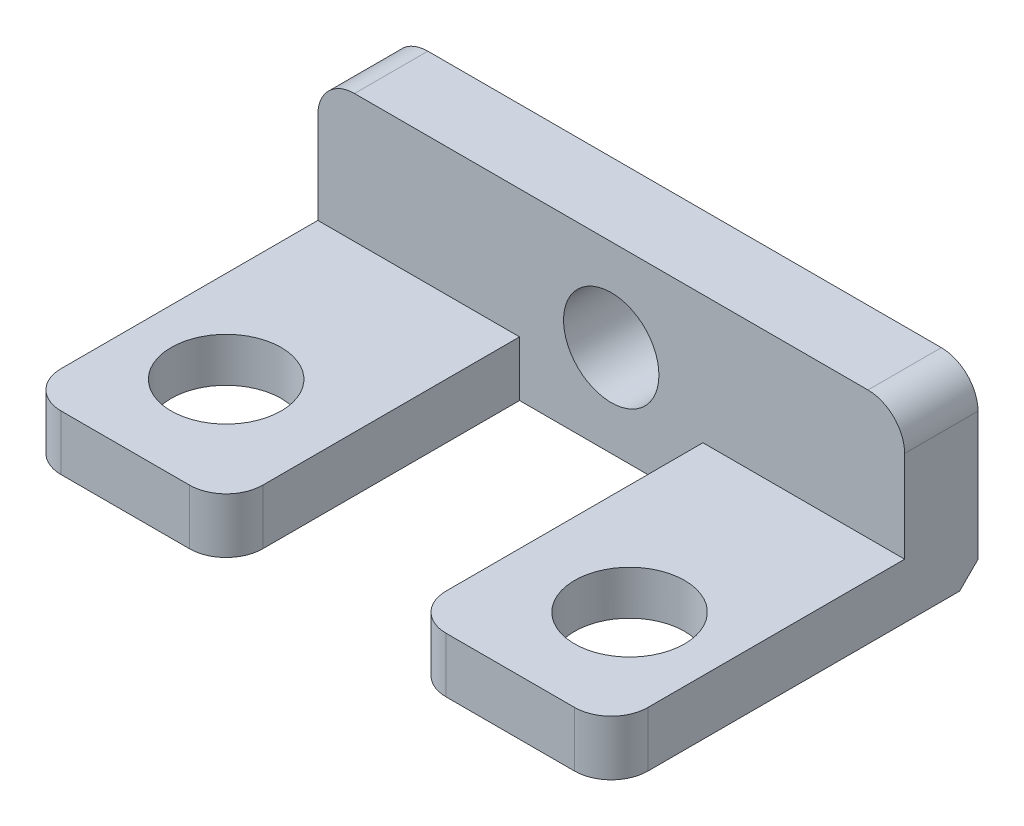
ISO-10303-21;
HEADER;
FILE_DESCRIPTION(('STEP AP214'),'2;1');
FILE_NAME('part.step','',(''),(''),'','','');
FILE_SCHEMA(('AUTOMOTIVE_DESIGN { 1 0 10303 214 1 1 1 1 }'));
ENDSEC;
DATA;
#1=APPLICATION_CONTEXT('core data for automotive mechanical design processes');
#2=APPLICATION_PROTOCOL_DEFINITION('international standard','automotive_design',2000,#1);
#3=PRODUCT_CONTEXT('',#1,'mechanical');
#4=PRODUCT('Part','Part','',(#3));
#5=PRODUCT_RELATED_PRODUCT_CATEGORY('part','',(#4));
#6=PRODUCT_DEFINITION_FORMATION('','',#4);
#7=PRODUCT_DEFINITION_CONTEXT('part definition',#1,'design');
#8=PRODUCT_DEFINITION('design','',#6,#7);
#9=PRODUCT_DEFINITION_SHAPE('','',#8);
#10=(LENGTH_UNIT() NAMED_UNIT(*) SI_UNIT(.MILLI.,.METRE.));
#11=(NAMED_UNIT(*) PLANE_ANGLE_UNIT() SI_UNIT($,.RADIAN.));
#12=(NAMED_UNIT(*) SI_UNIT($,.STERADIAN.) SOLID_ANGLE_UNIT());
#13=UNCERTAINTY_MEASURE_WITH_UNIT(LENGTH_MEASURE(1.E-05),#10,'distance_accuracy_value','');
#14=(GEOMETRIC_REPRESENTATION_CONTEXT(3) GLOBAL_UNCERTAINTY_ASSIGNED_CONTEXT((#13)) GLOBAL_UNIT_ASSIGNED_CONTEXT((#10,
#11,#12)) REPRESENTATION_CONTEXT('',''));
#15=CARTESIAN_POINT('',(0.,0.,0.));
#16=DIRECTION('',(0.,0.,1.));
#17=DIRECTION('',(1.,0.,0.));
#18=AXIS2_PLACEMENT_3D('',#15,#16,#17);
#19=CARTESIAN_POINT('',(13.5,2.,7.));
#20=DIRECTION('',(0.,-1.,0.));
#21=DIRECTION('',(0.,0.,-1.));
#22=AXIS2_PLACEMENT_3D('',#19,#20,#21);
#23=CYLINDRICAL_SURFACE('',#22,1.5);
#24=CARTESIAN_POINT('',(13.5,1.5038051120854,7.));
#25=DIRECTION('',(0.,-1.,0.));
#26=DIRECTION('',(1.,0.,0.));
#27=AXIS2_PLACEMENT_3D('',#24,#25,#26);
#28=CIRCLE('',#27,1.5);
#29=CARTESIAN_POINT('',(15.,1.5038051120854,7.));
#30=VERTEX_POINT('',#29);
#31=EDGE_CURVE('E232',#30,#30,#28,.T.);
#32=ORIENTED_EDGE('',*,*,#31,.F.);
#33=EDGE_LOOP('',(#32));
#34=FACE_BOUND('',#33,.T.);
#35=CARTESIAN_POINT('',(13.5,0.3,7.));
#36=DIRECTION('',(0.,-1.,0.));
#37=DIRECTION('',(0.,0.,-1.));
#38=AXIS2_PLACEMENT_3D('',#35,#36,#37);
#39=CIRCLE('',#38,1.5);
#40=CARTESIAN_POINT('',(13.5,0.3,5.5));
#41=VERTEX_POINT('',#40);
#42=EDGE_CURVE('E237',#41,#41,#39,.F.);
#43=ORIENTED_EDGE('',*,*,#42,.F.);
#44=EDGE_LOOP('',(#43));
#45=FACE_BOUND('',#44,.T.);
#46=ADVANCED_FACE('F40',(#34,#45),#23,.F.);
#47=CARTESIAN_POINT('',(2.5,2.,7.));
#48=DIRECTION('',(0.,-1.,0.));
#49=DIRECTION('',(0.,0.,-1.));
#50=AXIS2_PLACEMENT_3D('',#47,#48,#49);
#51=CYLINDRICAL_SURFACE('',#50,1.5);
#52=CARTESIAN_POINT('',(2.5,1.5038051120854,7.));
#53=DIRECTION('',(0.,-1.,0.));
#54=DIRECTION('',(1.,0.,0.));
#55=AXIS2_PLACEMENT_3D('',#52,#53,#54);
#56=CIRCLE('',#55,1.5);
#57=CARTESIAN_POINT('',(4.,1.5038051120854,7.));
#58=VERTEX_POINT('',#57);
#59=EDGE_CURVE('E228',#58,#58,#56,.T.);
#60=ORIENTED_EDGE('',*,*,#59,.F.);
#61=EDGE_LOOP('',(#60));
#62=FACE_BOUND('',#61,.T.);
#63=CARTESIAN_POINT('',(2.5,0.3,7.));
#64=DIRECTION('',(0.,-1.,0.));
#65=DIRECTION('',(0.,0.,-1.));
#66=AXIS2_PLACEMENT_3D('',#63,#64,#65);
#67=CIRCLE('',#66,1.5);
#68=CARTESIAN_POINT('',(2.5,0.3,5.5));
#69=VERTEX_POINT('',#68);
#70=EDGE_CURVE('E233',#69,#69,#67,.F.);
#71=ORIENTED_EDGE('',*,*,#70,.F.);
#72=EDGE_LOOP('',(#71));
#73=FACE_BOUND('',#72,.T.);
#74=ADVANCED_FACE('F375',(#62,#73),#51,.F.);
#75=CARTESIAN_POINT('',(0.,0.,10.));
#76=DIRECTION('',(0.,0.,-1.));
#77=DIRECTION('',(-1.,0.,0.));
#78=AXIS2_PLACEMENT_3D('',#75,#76,#77);
#79=PLANE('',#78);
#80=DIRECTION('',(1.,0.,0.));
#81=VECTOR('',#80,1.);
#82=CARTESIAN_POINT('',(0.,0.,10.));
#83=LINE('',#82,#81);
#84=CARTESIAN_POINT('',(11.5,0.,10.));
#85=VERTEX_POINT('',#84);
#86=CARTESIAN_POINT('',(15.,0.,10.));
#87=VERTEX_POINT('',#86);
#88=EDGE_CURVE('E217',#85,#87,#83,.T.);
#89=ORIENTED_EDGE('',*,*,#88,.T.);
#90=DIRECTION('',(0.,1.,0.));
#91=VECTOR('',#90,1.);
#92=CARTESIAN_POINT('',(15.,0.,10.));
#93=LINE('',#92,#91);
#94=CARTESIAN_POINT('',(15.,1.5038051120854,10.));
#95=VERTEX_POINT('',#94);
#96=EDGE_CURVE('E262',#87,#95,#93,.T.);
#97=ORIENTED_EDGE('',*,*,#96,.T.);
#98=DIRECTION('',(1.,0.,0.));
#99=VECTOR('',#98,1.);
#100=CARTESIAN_POINT('',(0.,1.5038051120854,10.));
#101=LINE('',#100,#99);
#102=CARTESIAN_POINT('',(11.5,1.5038051120854,10.));
#103=VERTEX_POINT('',#102);
#104=EDGE_CURVE('E192',#103,#95,#101,.T.);
#105=ORIENTED_EDGE('',*,*,#104,.F.);
#106=DIRECTION('',(0.,1.,0.));
#107=VECTOR('',#106,1.);
#108=CARTESIAN_POINT('',(11.5,0.,10.));
#109=LINE('',#108,#107);
#110=EDGE_CURVE('E260',#103,#85,#109,.F.);
#111=ORIENTED_EDGE('',*,*,#110,.T.);
#112=EDGE_LOOP('',(#89,#97,#105,#111));
#113=FACE_BOUND('',#112,.T.);
#114=ADVANCED_FACE('F312',(#113),#79,.F.);
#115=CARTESIAN_POINT('',(0.,1.5038051120854,-16.3775266354319));
#116=DIRECTION('',(0.,-1.,0.));
#117=DIRECTION('',(1.,0.,0.));
#118=AXIS2_PLACEMENT_3D('',#115,#116,#117);
#119=PLANE('',#118);
#120=ORIENTED_EDGE('',*,*,#31,.T.);
#121=EDGE_LOOP('',(#120));
#122=FACE_BOUND('',#121,.T.);
#123=ORIENTED_EDGE('',*,*,#104,.T.);
#124=CARTESIAN_POINT('',(15.,1.5038051120854,9.));
#125=DIRECTION('',(0.,-1.,0.));
#126=DIRECTION('',(1.,0.,0.));
#127=AXIS2_PLACEMENT_3D('',#124,#125,#126);
#128=CIRCLE('',#127,1.);
#129=CARTESIAN_POINT('',(16.,1.5038051120854,8.99999999999999));
#130=VERTEX_POINT('',#129);
#131=EDGE_CURVE('E267',#95,#130,#128,.F.);
#132=ORIENTED_EDGE('',*,*,#131,.T.);
#133=DIRECTION('',(0.,0.,1.));
#134=VECTOR('',#133,1.);
#135=CARTESIAN_POINT('',(16.,1.5038051120854,-16.3775266354319));
#136=LINE('',#135,#134);
#137=CARTESIAN_POINT('',(16.,1.5038051120854,1.99999999999999));
#138=VERTEX_POINT('',#137);
#139=EDGE_CURVE('E199',#138,#130,#136,.T.);
#140=ORIENTED_EDGE('',*,*,#139,.F.);
#141=DIRECTION('',(1.,0.,0.));
#142=VECTOR('',#141,1.);
#143=CARTESIAN_POINT('',(0.,1.5038051120854,2.));
#144=LINE('',#143,#142);
#145=CARTESIAN_POINT('',(10.5,1.5038051120854,2.));
#146=VERTEX_POINT('',#145);
#147=EDGE_CURVE('E196',#146,#138,#144,.T.);
#148=ORIENTED_EDGE('',*,*,#147,.F.);
#149=DIRECTION('',(0.,0.,1.));
#150=VECTOR('',#149,1.);
#151=CARTESIAN_POINT('',(10.5,1.5038051120854,-3.22124791741727));
#152=LINE('',#151,#150);
#153=CARTESIAN_POINT('',(10.5,1.5038051120854,9.));
#154=VERTEX_POINT('',#153);
#155=EDGE_CURVE('E166',#146,#154,#152,.T.);
#156=ORIENTED_EDGE('',*,*,#155,.T.);
#157=CARTESIAN_POINT('',(11.5,1.5038051120854,9.));
#158=DIRECTION('',(0.,-1.,0.));
#159=DIRECTION('',(1.,0.,0.));
#160=AXIS2_PLACEMENT_3D('',#157,#158,#159);
#161=CIRCLE('',#160,1.);
#162=EDGE_CURVE('E265',#154,#103,#161,.F.);
#163=ORIENTED_EDGE('',*,*,#162,.T.);
#164=EDGE_LOOP('',(#123,#132,#140,#148,#156,#163));
#165=FACE_BOUND('',#164,.T.);
#166=ADVANCED_FACE('F319',(#122,#165),#119,.F.);
#167=CARTESIAN_POINT('',(0.,0.,10.));
#168=DIRECTION('',(1.,0.,0.));
#169=DIRECTION('',(0.,0.,-1.));
#170=AXIS2_PLACEMENT_3D('',#167,#168,#169);
#171=PLANE('',#170);
#172=DIRECTION('',(0.,-1.,0.));
#173=VECTOR('',#172,1.);
#174=CARTESIAN_POINT('',(0.,0.,0.));
#175=LINE('',#174,#173);
#176=CARTESIAN_POINT('',(0.,4.,0.));
#177=VERTEX_POINT('',#176);
#178=CARTESIAN_POINT('',(0.,0.500000000000004,0.));
#179=VERTEX_POINT('',#178);
#180=EDGE_CURVE('E212',#177,#179,#175,.T.);
#181=ORIENTED_EDGE('',*,*,#180,.T.);
#182=DIRECTION('',(0.,-0.707106781186549,0.707106781186546));
#183=VECTOR('',#182,1.);
#184=CARTESIAN_POINT('',(0.,0.,0.500000000000002));
#185=LINE('',#184,#183);
#186=CARTESIAN_POINT('',(0.,0.,0.500000000000003));
#187=VERTEX_POINT('',#186);
#188=EDGE_CURVE('E12',#179,#187,#185,.T.);
#189=ORIENTED_EDGE('',*,*,#188,.T.);
#190=DIRECTION('',(0.,0.,-1.));
#191=VECTOR('',#190,1.);
#192=CARTESIAN_POINT('',(0.,0.,10.));
#193=LINE('',#192,#191);
#194=CARTESIAN_POINT('',(0.,0.,9.));
#195=VERTEX_POINT('',#194);
#196=EDGE_CURVE('E225',#195,#187,#193,.T.);
#197=ORIENTED_EDGE('',*,*,#196,.F.);
#198=DIRECTION('',(0.,-1.,0.));
#199=VECTOR('',#198,1.);
#200=CARTESIAN_POINT('',(0.,0.,9.));
#201=LINE('',#200,#199);
#202=CARTESIAN_POINT('',(0.,1.5038051120854,8.99999999999999));
#203=VERTEX_POINT('',#202);
#204=EDGE_CURVE('E292',#195,#203,#201,.F.);
#205=ORIENTED_EDGE('',*,*,#204,.T.);
#206=DIRECTION('',(0.,0.,1.));
#207=VECTOR('',#206,1.);
#208=CARTESIAN_POINT('',(0.,1.5038051120854,-16.3775266354319));
#209=LINE('',#208,#207);
#210=CARTESIAN_POINT('',(0.,1.5038051120854,2.));
#211=VERTEX_POINT('',#210);
#212=EDGE_CURVE('E202',#211,#203,#209,.T.);
#213=ORIENTED_EDGE('',*,*,#212,.F.);
#214=DIRECTION('',(0.,-1.,0.));
#215=VECTOR('',#214,1.);
#216=CARTESIAN_POINT('',(0.,5.,2.));
#217=LINE('',#216,#215);
#218=CARTESIAN_POINT('',(0.,4.,2.));
#219=VERTEX_POINT('',#218);
#220=EDGE_CURVE('E200',#219,#211,#217,.T.);
#221=ORIENTED_EDGE('',*,*,#220,.F.);
#222=DIRECTION('',(0.,0.,-1.));
#223=VECTOR('',#222,1.);
#224=CARTESIAN_POINT('',(0.,4.,10.));
#225=LINE('',#224,#223);
#226=EDGE_CURVE('E227',#219,#177,#225,.T.);
#227=ORIENTED_EDGE('',*,*,#226,.T.);
#228=EDGE_LOOP('',(#181,#189,#197,#205,#213,#221,#227));
#229=FACE_BOUND('',#228,.T.);
#230=ADVANCED_FACE('F355',(#229),#171,.F.);
#231=CARTESIAN_POINT('',(0.,0.,10.));
#232=DIRECTION('',(0.,1.,0.));
#233=DIRECTION('',(0.,0.,1.));
#234=AXIS2_PLACEMENT_3D('',#231,#232,#233);
#235=PLANE('',#234);
#236=CARTESIAN_POINT('',(13.5,0.,7.));
#237=DIRECTION('',(0.,-1.,0.));
#238=DIRECTION('',(0.,0.,-1.));
#239=AXIS2_PLACEMENT_3D('',#236,#237,#238);
#240=CIRCLE('',#239,2.);
#241=CARTESIAN_POINT('',(13.5,0.,5.));
#242=VERTEX_POINT('',#241);
#243=EDGE_CURVE('E337',#242,#242,#240,.T.);
#244=ORIENTED_EDGE('',*,*,#243,.F.);
#245=EDGE_LOOP('',(#244));
#246=FACE_BOUND('',#245,.T.);
#247=CARTESIAN_POINT('',(2.5,0.,7.));
#248=DIRECTION('',(0.,-1.,0.));
#249=DIRECTION('',(0.,0.,-1.));
#250=AXIS2_PLACEMENT_3D('',#247,#248,#249);
#251=CIRCLE('',#250,2.);
#252=CARTESIAN_POINT('',(2.5,0.,5.));
#253=VERTEX_POINT('',#252);
#254=EDGE_CURVE('E240',#253,#253,#251,.T.);
#255=ORIENTED_EDGE('',*,*,#254,.F.);
#256=EDGE_LOOP('',(#255));
#257=FACE_BOUND('',#256,.T.);
#258=ORIENTED_EDGE('',*,*,#196,.T.);
#259=DIRECTION('',(1.,0.,0.));
#260=VECTOR('',#259,1.);
#261=CARTESIAN_POINT('',(16.,0.,0.500000000000002));
#262=LINE('',#261,#260);
#263=CARTESIAN_POINT('',(16.,0.,0.500000000000003));
#264=VERTEX_POINT('',#263);
#265=EDGE_CURVE('E294',#187,#264,#262,.T.);
#266=ORIENTED_EDGE('',*,*,#265,.T.);
#267=DIRECTION('',(0.,0.,-1.));
#268=VECTOR('',#267,1.);
#269=CARTESIAN_POINT('',(16.,0.,10.));
#270=LINE('',#269,#268);
#271=CARTESIAN_POINT('',(16.,0.,9.));
#272=VERTEX_POINT('',#271);
#273=EDGE_CURVE('E216',#272,#264,#270,.T.);
#274=ORIENTED_EDGE('',*,*,#273,.F.);
#275=CARTESIAN_POINT('',(15.,0.,9.));
#276=DIRECTION('',(0.,1.,0.));
#277=DIRECTION('',(0.,0.,1.));
#278=AXIS2_PLACEMENT_3D('',#275,#276,#277);
#279=CIRCLE('',#278,1.);
#280=EDGE_CURVE('E276',#272,#87,#279,.F.);
#281=ORIENTED_EDGE('',*,*,#280,.T.);
#282=ORIENTED_EDGE('',*,*,#88,.F.);
#283=CARTESIAN_POINT('',(11.5,0.,9.));
#284=DIRECTION('',(0.,1.,0.));
#285=DIRECTION('',(0.,0.,1.));
#286=AXIS2_PLACEMENT_3D('',#283,#284,#285);
#287=CIRCLE('',#286,1.);
#288=CARTESIAN_POINT('',(10.5,0.,9.));
#289=VERTEX_POINT('',#288);
#290=EDGE_CURVE('E185',#85,#289,#287,.F.);
#291=ORIENTED_EDGE('',*,*,#290,.T.);
#292=DIRECTION('',(0.,0.,1.));
#293=VECTOR('',#292,1.);
#294=CARTESIAN_POINT('',(10.5,0.,-3.22124791741727));
#295=LINE('',#294,#293);
#296=CARTESIAN_POINT('',(10.5,0.,2.));
#297=VERTEX_POINT('',#296);
#298=EDGE_CURVE('E163',#297,#289,#295,.T.);
#299=ORIENTED_EDGE('',*,*,#298,.F.);
#300=DIRECTION('',(1.,0.,0.));
#301=VECTOR('',#300,1.);
#302=CARTESIAN_POINT('',(5.5,0.,2.));
#303=LINE('',#302,#301);
#304=CARTESIAN_POINT('',(5.5,0.,2.));
#305=VERTEX_POINT('',#304);
#306=EDGE_CURVE('E171',#305,#297,#303,.T.);
#307=ORIENTED_EDGE('',*,*,#306,.F.);
#308=DIRECTION('',(0.,0.,1.));
#309=VECTOR('',#308,1.);
#310=CARTESIAN_POINT('',(5.5,0.,-3.22124791741727));
#311=LINE('',#310,#309);
#312=CARTESIAN_POINT('',(5.5,0.,9.));
#313=VERTEX_POINT('',#312);
#314=EDGE_CURVE('E190',#305,#313,#311,.T.);
#315=ORIENTED_EDGE('',*,*,#314,.T.);
#316=CARTESIAN_POINT('',(4.5,0.,9.));
#317=DIRECTION('',(0.,1.,0.));
#318=DIRECTION('',(0.,0.,1.));
#319=AXIS2_PLACEMENT_3D('',#316,#317,#318);
#320=CIRCLE('',#319,1.);
#321=CARTESIAN_POINT('',(4.5,0.,10.));
#322=VERTEX_POINT('',#321);
#323=EDGE_CURVE('E273',#313,#322,#320,.F.);
#324=ORIENTED_EDGE('',*,*,#323,.T.);
#325=CARTESIAN_POINT('',(1.,0.,10.));
#326=VERTEX_POINT('',#325);
#327=EDGE_CURVE('E213',#326,#322,#83,.T.);
#328=ORIENTED_EDGE('',*,*,#327,.F.);
#329=CARTESIAN_POINT('',(1.,0.,9.));
#330=DIRECTION('',(0.,1.,0.));
#331=DIRECTION('',(0.,0.,1.));
#332=AXIS2_PLACEMENT_3D('',#329,#330,#331);
#333=CIRCLE('',#332,1.);
#334=EDGE_CURVE('E271',#326,#195,#333,.F.);
#335=ORIENTED_EDGE('',*,*,#334,.T.);
#336=EDGE_LOOP('',(#258,#266,#274,#281,#282,#291,#299,#307,#315,#324,#328,#335));
#337=FACE_BOUND('',#336,.T.);
#338=ADVANCED_FACE('F182',(#246,#257,#337),#235,.F.);
#339=CARTESIAN_POINT('',(16.,0.,10.));
#340=DIRECTION('',(-1.,0.,0.));
#341=DIRECTION('',(0.,0.,1.));
#342=AXIS2_PLACEMENT_3D('',#339,#340,#341);
#343=PLANE('',#342);
#344=ORIENTED_EDGE('',*,*,#273,.T.);
#345=DIRECTION('',(0.,0.707106781186549,-0.707106781186546));
#346=VECTOR('',#345,1.);
#347=CARTESIAN_POINT('',(16.,0.,0.500000000000002));
#348=LINE('',#347,#346);
#349=CARTESIAN_POINT('',(16.,0.500000000000004,0.));
#350=VERTEX_POINT('',#349);
#351=EDGE_CURVE('E62',#264,#350,#348,.T.);
#352=ORIENTED_EDGE('',*,*,#351,.T.);
#353=DIRECTION('',(0.,1.,0.));
#354=VECTOR('',#353,1.);
#355=CARTESIAN_POINT('',(16.,0.,0.));
#356=LINE('',#355,#354);
#357=CARTESIAN_POINT('',(16.,4.,0.));
#358=VERTEX_POINT('',#357);
#359=EDGE_CURVE('E219',#350,#358,#356,.T.);
#360=ORIENTED_EDGE('',*,*,#359,.T.);
#361=DIRECTION('',(0.,0.,-1.));
#362=VECTOR('',#361,1.);
#363=CARTESIAN_POINT('',(16.,4.,10.));
#364=LINE('',#363,#362);
#365=CARTESIAN_POINT('',(16.,4.,2.));
#366=VERTEX_POINT('',#365);
#367=EDGE_CURVE('E258',#358,#366,#364,.F.);
#368=ORIENTED_EDGE('',*,*,#367,.T.);
#369=DIRECTION('',(0.,1.,0.));
#370=VECTOR('',#369,1.);
#371=CARTESIAN_POINT('',(16.,5.,2.));
#372=LINE('',#371,#370);
#373=EDGE_CURVE('E205',#138,#366,#372,.T.);
#374=ORIENTED_EDGE('',*,*,#373,.F.);
#375=ORIENTED_EDGE('',*,*,#139,.T.);
#376=DIRECTION('',(0.,1.,0.));
#377=VECTOR('',#376,1.);
#378=CARTESIAN_POINT('',(16.,0.,9.));
#379=LINE('',#378,#377);
#380=EDGE_CURVE('E269',#130,#272,#379,.F.);
#381=ORIENTED_EDGE('',*,*,#380,.T.);
#382=EDGE_LOOP('',(#344,#352,#360,#368,#374,#375,#381));
#383=FACE_BOUND('',#382,.T.);
#384=ADVANCED_FACE('F303',(#383),#343,.F.);
#385=CARTESIAN_POINT('',(0.,5.,10.));
#386=DIRECTION('',(0.,-1.,0.));
#387=DIRECTION('',(0.,0.,-1.));
#388=AXIS2_PLACEMENT_3D('',#385,#386,#387);
#389=PLANE('',#388);
#390=DIRECTION('',(-1.,0.,0.));
#391=VECTOR('',#390,1.);
#392=CARTESIAN_POINT('',(0.,5.,0.));
#393=LINE('',#392,#391);
#394=CARTESIAN_POINT('',(15.,5.,0.));
#395=VERTEX_POINT('',#394);
#396=CARTESIAN_POINT('',(1.,5.,0.));
#397=VERTEX_POINT('',#396);
#398=EDGE_CURVE('E221',#395,#397,#393,.T.);
#399=ORIENTED_EDGE('',*,*,#398,.T.);
#400=DIRECTION('',(0.,0.,-1.));
#401=VECTOR('',#400,1.);
#402=CARTESIAN_POINT('',(1.,5.,10.));
#403=LINE('',#402,#401);
#404=CARTESIAN_POINT('',(1.,5.,2.));
#405=VERTEX_POINT('',#404);
#406=EDGE_CURVE('E252',#397,#405,#403,.F.);
#407=ORIENTED_EDGE('',*,*,#406,.T.);
#408=DIRECTION('',(-1.,0.,0.));
#409=VECTOR('',#408,1.);
#410=CARTESIAN_POINT('',(0.,5.,2.));
#411=LINE('',#410,#409);
#412=CARTESIAN_POINT('',(15.,5.,2.));
#413=VERTEX_POINT('',#412);
#414=EDGE_CURVE('E203',#413,#405,#411,.T.);
#415=ORIENTED_EDGE('',*,*,#414,.F.);
#416=DIRECTION('',(0.,0.,-1.));
#417=VECTOR('',#416,1.);
#418=CARTESIAN_POINT('',(15.,5.,10.));
#419=LINE('',#418,#417);
#420=EDGE_CURVE('E249',#413,#395,#419,.T.);
#421=ORIENTED_EDGE('',*,*,#420,.T.);
#422=EDGE_LOOP('',(#399,#407,#415,#421));
#423=FACE_BOUND('',#422,.T.);
#424=ADVANCED_FACE('F404',(#423),#389,.F.);
#425=ORIENTED_EDGE('',*,*,#327,.T.);
#426=DIRECTION('',(0.,-1.,0.));
#427=VECTOR('',#426,1.);
#428=CARTESIAN_POINT('',(4.5,0.,10.));
#429=LINE('',#428,#427);
#430=CARTESIAN_POINT('',(4.5,1.5038051120854,10.));
#431=VERTEX_POINT('',#430);
#432=EDGE_CURVE('E286',#322,#431,#429,.F.);
#433=ORIENTED_EDGE('',*,*,#432,.T.);
#434=CARTESIAN_POINT('',(1.,1.5038051120854,10.));
#435=VERTEX_POINT('',#434);
#436=EDGE_CURVE('E193',#435,#431,#101,.T.);
#437=ORIENTED_EDGE('',*,*,#436,.F.);
#438=DIRECTION('',(0.,-1.,0.));
#439=VECTOR('',#438,1.);
#440=CARTESIAN_POINT('',(1.,0.,10.));
#441=LINE('',#440,#439);
#442=EDGE_CURVE('E283',#435,#326,#441,.T.);
#443=ORIENTED_EDGE('',*,*,#442,.T.);
#444=EDGE_LOOP('',(#425,#433,#437,#443));
#445=FACE_BOUND('',#444,.T.);
#446=ADVANCED_FACE('F401',(#445),#79,.F.);
#447=CARTESIAN_POINT('',(0.,0.,0.));
#448=DIRECTION('',(0.,0.,-1.));
#449=DIRECTION('',(-1.,0.,0.));
#450=AXIS2_PLACEMENT_3D('',#447,#448,#449);
#451=PLANE('',#450);
#452=CARTESIAN_POINT('',(8.,2.5,0.));
#453=DIRECTION('',(0.,0.,1.));
#454=DIRECTION('',(1.,0.,0.));
#455=AXIS2_PLACEMENT_3D('',#452,#453,#454);
#456=CIRCLE('',#455,1.3);
#457=CARTESIAN_POINT('',(9.3,2.5,0.));
#458=VERTEX_POINT('',#457);
#459=EDGE_CURVE('E179',#458,#458,#456,.T.);
#460=ORIENTED_EDGE('',*,*,#459,.T.);
#461=EDGE_LOOP('',(#460));
#462=FACE_BOUND('',#461,.T.);
#463=ORIENTED_EDGE('',*,*,#359,.F.);
#464=DIRECTION('',(-1.,0.,0.));
#465=VECTOR('',#464,1.);
#466=CARTESIAN_POINT('',(0.,0.500000000000004,0.));
#467=LINE('',#466,#465);
#468=EDGE_CURVE('E48',#350,#179,#467,.T.);
#469=ORIENTED_EDGE('',*,*,#468,.T.);
#470=ORIENTED_EDGE('',*,*,#180,.F.);
#471=CARTESIAN_POINT('',(1.,4.,0.));
#472=DIRECTION('',(0.,0.,-1.));
#473=DIRECTION('',(-1.,0.,0.));
#474=AXIS2_PLACEMENT_3D('',#471,#472,#473);
#475=CIRCLE('',#474,1.);
#476=EDGE_CURVE('E247',#177,#397,#475,.T.);
#477=ORIENTED_EDGE('',*,*,#476,.T.);
#478=ORIENTED_EDGE('',*,*,#398,.F.);
#479=CARTESIAN_POINT('',(15.,4.,0.));
#480=DIRECTION('',(0.,0.,-1.));
#481=DIRECTION('',(-1.,0.,0.));
#482=AXIS2_PLACEMENT_3D('',#479,#480,#481);
#483=CIRCLE('',#482,1.);
#484=EDGE_CURVE('E244',#395,#358,#483,.T.);
#485=ORIENTED_EDGE('',*,*,#484,.T.);
#486=EDGE_LOOP('',(#463,#469,#470,#477,#478,#485));
#487=FACE_BOUND('',#486,.T.);
#488=ADVANCED_FACE('F399',(#462,#487),#451,.T.);
#489=CARTESIAN_POINT('',(0.,0.,2.));
#490=DIRECTION('',(0.,0.,-1.));
#491=DIRECTION('',(-1.,0.,0.));
#492=AXIS2_PLACEMENT_3D('',#489,#490,#491);
#493=PLANE('',#492);
#494=CARTESIAN_POINT('',(8.,2.5,2.));
#495=DIRECTION('',(0.,0.,1.));
#496=DIRECTION('',(1.,0.,0.));
#497=AXIS2_PLACEMENT_3D('',#494,#495,#496);
#498=CIRCLE('',#497,1.3);
#499=CARTESIAN_POINT('',(9.3,2.5,2.));
#500=VERTEX_POINT('',#499);
#501=EDGE_CURVE('E231',#500,#500,#498,.T.);
#502=ORIENTED_EDGE('',*,*,#501,.F.);
#503=EDGE_LOOP('',(#502));
#504=FACE_BOUND('',#503,.T.);
#505=ORIENTED_EDGE('',*,*,#414,.T.);
#506=CARTESIAN_POINT('',(1.,4.,2.));
#507=DIRECTION('',(0.,0.,-1.));
#508=DIRECTION('',(-1.,0.,0.));
#509=AXIS2_PLACEMENT_3D('',#506,#507,#508);
#510=CIRCLE('',#509,1.);
#511=EDGE_CURVE('E256',#405,#219,#510,.F.);
#512=ORIENTED_EDGE('',*,*,#511,.T.);
#513=ORIENTED_EDGE('',*,*,#220,.T.);
#514=CARTESIAN_POINT('',(5.5,1.5038051120854,2.));
#515=VERTEX_POINT('',#514);
#516=EDGE_CURVE('E197',#211,#515,#144,.T.);
#517=ORIENTED_EDGE('',*,*,#516,.T.);
#518=DIRECTION('',(0.,-1.,0.));
#519=VECTOR('',#518,1.);
#520=CARTESIAN_POINT('',(5.5,1.5038051120854,2.));
#521=LINE('',#520,#519);
#522=EDGE_CURVE('E175',#515,#305,#521,.T.);
#523=ORIENTED_EDGE('',*,*,#522,.T.);
#524=ORIENTED_EDGE('',*,*,#306,.T.);
#525=DIRECTION('',(0.,1.,0.));
#526=VECTOR('',#525,1.);
#527=CARTESIAN_POINT('',(10.5,1.5038051120854,2.));
#528=LINE('',#527,#526);
#529=EDGE_CURVE('E158',#297,#146,#528,.T.);
#530=ORIENTED_EDGE('',*,*,#529,.T.);
#531=ORIENTED_EDGE('',*,*,#147,.T.);
#532=ORIENTED_EDGE('',*,*,#373,.T.);
#533=CARTESIAN_POINT('',(15.,4.,2.));
#534=DIRECTION('',(0.,0.,-1.));
#535=DIRECTION('',(-1.,0.,0.));
#536=AXIS2_PLACEMENT_3D('',#533,#534,#535);
#537=CIRCLE('',#536,1.);
#538=EDGE_CURVE('E254',#366,#413,#537,.F.);
#539=ORIENTED_EDGE('',*,*,#538,.T.);
#540=EDGE_LOOP('',(#505,#512,#513,#517,#523,#524,#530,#531,#532,#539));
#541=FACE_BOUND('',#540,.T.);
#542=ADVANCED_FACE('F173',(#504,#541),#493,.F.);
#543=ORIENTED_EDGE('',*,*,#59,.T.);
#544=EDGE_LOOP('',(#543));
#545=FACE_BOUND('',#544,.T.);
#546=ORIENTED_EDGE('',*,*,#436,.T.);
#547=CARTESIAN_POINT('',(4.5,1.5038051120854,9.));
#548=DIRECTION('',(0.,-1.,0.));
#549=DIRECTION('',(1.,0.,0.));
#550=AXIS2_PLACEMENT_3D('',#547,#548,#549);
#551=CIRCLE('',#550,1.);
#552=CARTESIAN_POINT('',(5.5,1.5038051120854,9.));
#553=VERTEX_POINT('',#552);
#554=EDGE_CURVE('E290',#431,#553,#551,.F.);
#555=ORIENTED_EDGE('',*,*,#554,.T.);
#556=DIRECTION('',(0.,0.,1.));
#557=VECTOR('',#556,1.);
#558=CARTESIAN_POINT('',(5.5,1.5038051120854,-3.22124791741727));
#559=LINE('',#558,#557);
#560=EDGE_CURVE('E320',#515,#553,#559,.T.);
#561=ORIENTED_EDGE('',*,*,#560,.F.);
#562=ORIENTED_EDGE('',*,*,#516,.F.);
#563=ORIENTED_EDGE('',*,*,#212,.T.);
#564=CARTESIAN_POINT('',(1.,1.5038051120854,9.));
#565=DIRECTION('',(0.,-1.,0.));
#566=DIRECTION('',(1.,0.,0.));
#567=AXIS2_PLACEMENT_3D('',#564,#565,#566);
#568=CIRCLE('',#567,1.);
#569=EDGE_CURVE('E288',#203,#435,#568,.F.);
#570=ORIENTED_EDGE('',*,*,#569,.T.);
#571=EDGE_LOOP('',(#546,#555,#561,#562,#563,#570));
#572=FACE_BOUND('',#571,.T.);
#573=ADVANCED_FACE('F393',(#545,#572),#119,.F.);
#574=CARTESIAN_POINT('',(10.5,1.5038051120854,-3.22124791741727));
#575=DIRECTION('',(1.,0.,0.));
#576=DIRECTION('',(0.,0.,-1.));
#577=AXIS2_PLACEMENT_3D('',#574,#575,#576);
#578=PLANE('',#577);
#579=ORIENTED_EDGE('',*,*,#298,.T.);
#580=DIRECTION('',(0.,1.,0.));
#581=VECTOR('',#580,1.);
#582=CARTESIAN_POINT('',(10.5,1.5038051120854,9.));
#583=LINE('',#582,#581);
#584=EDGE_CURVE('E278',#289,#154,#583,.T.);
#585=ORIENTED_EDGE('',*,*,#584,.T.);
#586=ORIENTED_EDGE('',*,*,#155,.F.);
#587=ORIENTED_EDGE('',*,*,#529,.F.);
#588=EDGE_LOOP('',(#579,#585,#586,#587));
#589=FACE_BOUND('',#588,.T.);
#590=ADVANCED_FACE('F160',(#589),#578,.F.);
#591=CARTESIAN_POINT('',(5.5,1.5038051120854,-3.22124791741727));
#592=DIRECTION('',(-1.,0.,0.));
#593=DIRECTION('',(0.,0.,1.));
#594=AXIS2_PLACEMENT_3D('',#591,#592,#593);
#595=PLANE('',#594);
#596=ORIENTED_EDGE('',*,*,#560,.T.);
#597=DIRECTION('',(0.,-1.,0.));
#598=VECTOR('',#597,1.);
#599=CARTESIAN_POINT('',(5.5,1.5038051120854,9.));
#600=LINE('',#599,#598);
#601=EDGE_CURVE('E280',#553,#313,#600,.T.);
#602=ORIENTED_EDGE('',*,*,#601,.T.);
#603=ORIENTED_EDGE('',*,*,#314,.F.);
#604=ORIENTED_EDGE('',*,*,#522,.F.);
#605=EDGE_LOOP('',(#596,#602,#603,#604));
#606=FACE_BOUND('',#605,.T.);
#607=ADVANCED_FACE('F387',(#606),#595,.F.);
#608=CARTESIAN_POINT('',(8.,2.5,0.));
#609=DIRECTION('',(0.,0.,1.));
#610=DIRECTION('',(1.,0.,0.));
#611=AXIS2_PLACEMENT_3D('',#608,#609,#610);
#612=CYLINDRICAL_SURFACE('',#611,1.3);
#613=ORIENTED_EDGE('',*,*,#459,.F.);
#614=EDGE_LOOP('',(#613));
#615=FACE_BOUND('',#614,.T.);
#616=ORIENTED_EDGE('',*,*,#501,.T.);
#617=EDGE_LOOP('',(#616));
#618=FACE_BOUND('',#617,.T.);
#619=ADVANCED_FACE('F369',(#615,#618),#612,.F.);
#620=CARTESIAN_POINT('',(2.5,0.3,7.));
#621=DIRECTION('',(0.,-1.,0.));
#622=DIRECTION('',(0.,0.,-1.));
#623=AXIS2_PLACEMENT_3D('',#620,#621,#622);
#624=PLANE('',#623);
#625=CARTESIAN_POINT('',(2.5,0.3,7.));
#626=DIRECTION('',(0.,-1.,0.));
#627=DIRECTION('',(0.,0.,-1.));
#628=AXIS2_PLACEMENT_3D('',#625,#626,#627);
#629=CIRCLE('',#628,2.);
#630=CARTESIAN_POINT('',(2.5,0.3,5.));
#631=VERTEX_POINT('',#630);
#632=EDGE_CURVE('E236',#631,#631,#629,.T.);
#633=ORIENTED_EDGE('',*,*,#632,.T.);
#634=EDGE_LOOP('',(#633));
#635=FACE_BOUND('',#634,.T.);
#636=ORIENTED_EDGE('',*,*,#70,.T.);
#637=EDGE_LOOP('',(#636));
#638=FACE_BOUND('',#637,.T.);
#639=ADVANCED_FACE('F361',(#635,#638),#624,.T.);
#640=CARTESIAN_POINT('',(2.5,0.3,7.));
#641=DIRECTION('',(0.,-1.,0.));
#642=DIRECTION('',(0.,0.,-1.));
#643=AXIS2_PLACEMENT_3D('',#640,#641,#642);
#644=CYLINDRICAL_SURFACE('',#643,2.);
#645=ORIENTED_EDGE('',*,*,#632,.F.);
#646=EDGE_LOOP('',(#645));
#647=FACE_BOUND('',#646,.T.);
#648=ORIENTED_EDGE('',*,*,#254,.T.);
#649=EDGE_LOOP('',(#648));
#650=FACE_BOUND('',#649,.T.);
#651=ADVANCED_FACE('F359',(#647,#650),#644,.F.);
#652=CARTESIAN_POINT('',(13.5,0.3,7.));
#653=DIRECTION('',(0.,-1.,0.));
#654=DIRECTION('',(0.,0.,-1.));
#655=AXIS2_PLACEMENT_3D('',#652,#653,#654);
#656=PLANE('',#655);
#657=CARTESIAN_POINT('',(13.5,0.3,7.));
#658=DIRECTION('',(0.,-1.,0.));
#659=DIRECTION('',(0.,0.,-1.));
#660=AXIS2_PLACEMENT_3D('',#657,#658,#659);
#661=CIRCLE('',#660,2.);
#662=CARTESIAN_POINT('',(13.5,0.3,5.));
#663=VERTEX_POINT('',#662);
#664=EDGE_CURVE('E241',#663,#663,#661,.T.);
#665=ORIENTED_EDGE('',*,*,#664,.T.);
#666=EDGE_LOOP('',(#665));
#667=FACE_BOUND('',#666,.T.);
#668=ORIENTED_EDGE('',*,*,#42,.T.);
#669=EDGE_LOOP('',(#668));
#670=FACE_BOUND('',#669,.T.);
#671=ADVANCED_FACE('F343',(#667,#670),#656,.T.);
#672=CARTESIAN_POINT('',(13.5,0.3,7.));
#673=DIRECTION('',(0.,-1.,0.));
#674=DIRECTION('',(0.,0.,-1.));
#675=AXIS2_PLACEMENT_3D('',#672,#673,#674);
#676=CYLINDRICAL_SURFACE('',#675,2.);
#677=ORIENTED_EDGE('',*,*,#664,.F.);
#678=EDGE_LOOP('',(#677));
#679=FACE_BOUND('',#678,.T.);
#680=ORIENTED_EDGE('',*,*,#243,.T.);
#681=EDGE_LOOP('',(#680));
#682=FACE_BOUND('',#681,.T.);
#683=ADVANCED_FACE('F346',(#679,#682),#676,.F.);
#684=CARTESIAN_POINT('',(1.,4.,10.));
#685=DIRECTION('',(0.,0.,-1.));
#686=DIRECTION('',(-1.,0.,0.));
#687=AXIS2_PLACEMENT_3D('',#684,#685,#686);
#688=CYLINDRICAL_SURFACE('',#687,1.);
#689=ORIENTED_EDGE('',*,*,#511,.F.);
#690=ORIENTED_EDGE('',*,*,#406,.F.);
#691=ORIENTED_EDGE('',*,*,#476,.F.);
#692=ORIENTED_EDGE('',*,*,#226,.F.);
#693=EDGE_LOOP('',(#689,#690,#691,#692));
#694=FACE_BOUND('',#693,.T.);
#695=ADVANCED_FACE('F349',(#694),#688,.T.);
#696=CARTESIAN_POINT('',(15.,4.,10.));
#697=DIRECTION('',(0.,0.,-1.));
#698=DIRECTION('',(-1.,0.,0.));
#699=AXIS2_PLACEMENT_3D('',#696,#697,#698);
#700=CYLINDRICAL_SURFACE('',#699,1.);
#701=ORIENTED_EDGE('',*,*,#538,.F.);
#702=ORIENTED_EDGE('',*,*,#367,.F.);
#703=ORIENTED_EDGE('',*,*,#484,.F.);
#704=ORIENTED_EDGE('',*,*,#420,.F.);
#705=EDGE_LOOP('',(#701,#702,#703,#704));
#706=FACE_BOUND('',#705,.T.);
#707=ADVANCED_FACE('F419',(#706),#700,.T.);
#708=CARTESIAN_POINT('',(15.,0.,9.));
#709=DIRECTION('',(0.,1.,0.));
#710=DIRECTION('',(0.,0.,1.));
#711=AXIS2_PLACEMENT_3D('',#708,#709,#710);
#712=CYLINDRICAL_SURFACE('',#711,1.);
#713=ORIENTED_EDGE('',*,*,#280,.F.);
#714=ORIENTED_EDGE('',*,*,#380,.F.);
#715=ORIENTED_EDGE('',*,*,#131,.F.);
#716=ORIENTED_EDGE('',*,*,#96,.F.);
#717=EDGE_LOOP('',(#713,#714,#715,#716));
#718=FACE_BOUND('',#717,.T.);
#719=ADVANCED_FACE('F308',(#718),#712,.T.);
#720=CARTESIAN_POINT('',(11.5,1.5038051120854,9.));
#721=DIRECTION('',(0.,1.,0.));
#722=DIRECTION('',(0.,0.,1.));
#723=AXIS2_PLACEMENT_3D('',#720,#721,#722);
#724=CYLINDRICAL_SURFACE('',#723,1.);
#725=ORIENTED_EDGE('',*,*,#290,.F.);
#726=ORIENTED_EDGE('',*,*,#110,.F.);
#727=ORIENTED_EDGE('',*,*,#162,.F.);
#728=ORIENTED_EDGE('',*,*,#584,.F.);
#729=EDGE_LOOP('',(#725,#726,#727,#728));
#730=FACE_BOUND('',#729,.T.);
#731=ADVANCED_FACE('F317',(#730),#724,.T.);
#732=CARTESIAN_POINT('',(4.5,1.5038051120854,9.));
#733=DIRECTION('',(0.,-1.,0.));
#734=DIRECTION('',(0.,0.,-1.));
#735=AXIS2_PLACEMENT_3D('',#732,#733,#734);
#736=CYLINDRICAL_SURFACE('',#735,1.);
#737=ORIENTED_EDGE('',*,*,#554,.F.);
#738=ORIENTED_EDGE('',*,*,#432,.F.);
#739=ORIENTED_EDGE('',*,*,#323,.F.);
#740=ORIENTED_EDGE('',*,*,#601,.F.);
#741=EDGE_LOOP('',(#737,#738,#739,#740));
#742=FACE_BOUND('',#741,.T.);
#743=ADVANCED_FACE('F428',(#742),#736,.T.);
#744=CARTESIAN_POINT('',(1.,0.,9.));
#745=DIRECTION('',(0.,-1.,0.));
#746=DIRECTION('',(0.,0.,-1.));
#747=AXIS2_PLACEMENT_3D('',#744,#745,#746);
#748=CYLINDRICAL_SURFACE('',#747,1.);
#749=ORIENTED_EDGE('',*,*,#569,.F.);
#750=ORIENTED_EDGE('',*,*,#204,.F.);
#751=ORIENTED_EDGE('',*,*,#334,.F.);
#752=ORIENTED_EDGE('',*,*,#442,.F.);
#753=EDGE_LOOP('',(#749,#750,#751,#752));
#754=FACE_BOUND('',#753,.T.);
#755=ADVANCED_FACE('F430',(#754),#748,.T.);
#756=CARTESIAN_POINT('',(0.,0.,0.500000000000002));
#757=DIRECTION('',(0.,-0.707106781186546,-0.707106781186549));
#758=DIRECTION('',(-1.,0.,0.));
#759=AXIS2_PLACEMENT_3D('',#756,#757,#758);
#760=PLANE('',#759);
#761=ORIENTED_EDGE('',*,*,#188,.F.);
#762=ORIENTED_EDGE('',*,*,#468,.F.);
#763=ORIENTED_EDGE('',*,*,#351,.F.);
#764=ORIENTED_EDGE('',*,*,#265,.F.);
#765=EDGE_LOOP('',(#761,#762,#763,#764));
#766=FACE_BOUND('',#765,.T.);
#767=ADVANCED_FACE('F42',(#766),#760,.T.);
#768=CLOSED_SHELL('',(#46,#74,#114,#166,#230,#338,#384,#424,#446,#488,#542,#573,#590,#607,#619,
#639,#651,#671,#683,#695,#707,#719,#731,#743,#755,#767));
#769=MANIFOLD_SOLID_BREP('B2',#768);
#770=ADVANCED_BREP_SHAPE_REPRESENTATION('',(#18,#769),#14);
#771=SHAPE_DEFINITION_REPRESENTATION(#9,#770);
ENDSEC;
END-ISO-10303-21;
